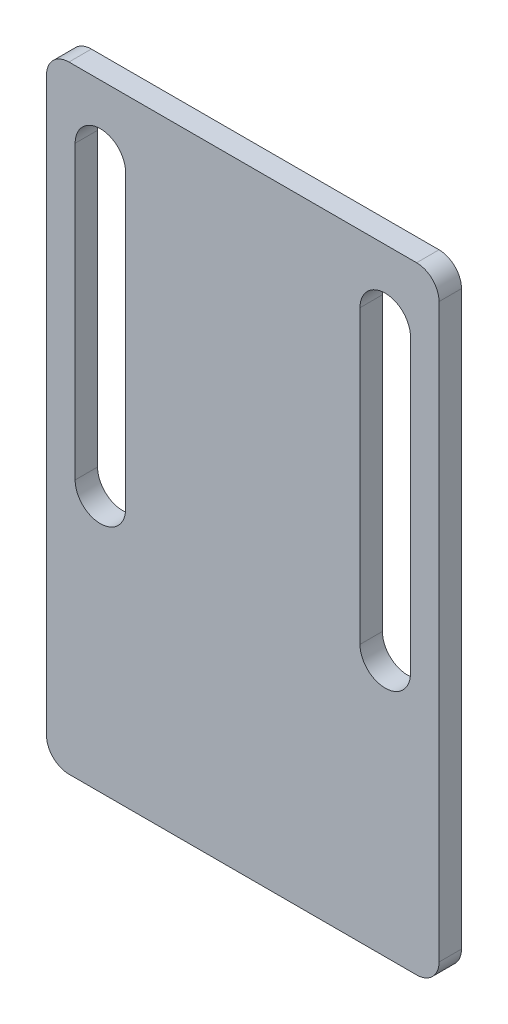
ISO-10303-21;
HEADER;
FILE_DESCRIPTION(('STEP AP214'),'2;1');
FILE_NAME('part.step','',(''),(''),'','','');
FILE_SCHEMA(('AUTOMOTIVE_DESIGN { 1 0 10303 214 1 1 1 1 }'));
ENDSEC;
DATA;
#1=APPLICATION_CONTEXT('core data for automotive mechanical design processes');
#2=APPLICATION_PROTOCOL_DEFINITION('international standard','automotive_design',2000,#1);
#3=PRODUCT_CONTEXT('',#1,'mechanical');
#4=PRODUCT('Part','Part','',(#3));
#5=PRODUCT_RELATED_PRODUCT_CATEGORY('part','',(#4));
#6=PRODUCT_DEFINITION_FORMATION('','',#4);
#7=PRODUCT_DEFINITION_CONTEXT('part definition',#1,'design');
#8=PRODUCT_DEFINITION('design','',#6,#7);
#9=PRODUCT_DEFINITION_SHAPE('','',#8);
#10=(LENGTH_UNIT() NAMED_UNIT(*) SI_UNIT(.MILLI.,.METRE.));
#11=(NAMED_UNIT(*) PLANE_ANGLE_UNIT() SI_UNIT($,.RADIAN.));
#12=(NAMED_UNIT(*) SI_UNIT($,.STERADIAN.) SOLID_ANGLE_UNIT());
#13=UNCERTAINTY_MEASURE_WITH_UNIT(LENGTH_MEASURE(1.E-05),#10,'distance_accuracy_value','');
#14=(GEOMETRIC_REPRESENTATION_CONTEXT(3) GLOBAL_UNCERTAINTY_ASSIGNED_CONTEXT((#13)) GLOBAL_UNIT_ASSIGNED_CONTEXT((#10,
#11,#12)) REPRESENTATION_CONTEXT('',''));
#15=CARTESIAN_POINT('',(0.,0.,0.));
#16=DIRECTION('',(0.,0.,1.));
#17=DIRECTION('',(1.,0.,0.));
#18=AXIS2_PLACEMENT_3D('',#15,#16,#17);
#19=CARTESIAN_POINT('',(-17.5,-27.5,2.));
#20=DIRECTION('',(1.,0.,0.));
#21=DIRECTION('',(0.,-1.,0.));
#22=AXIS2_PLACEMENT_3D('',#19,#20,#21);
#23=PLANE('',#22);
#24=DIRECTION('',(0.,-1.,0.));
#25=VECTOR('',#24,1.);
#26=CARTESIAN_POINT('',(-17.5,-27.5,2.));
#27=LINE('',#26,#25);
#28=CARTESIAN_POINT('',(-17.5,25.5,2.));
#29=VERTEX_POINT('',#28);
#30=CARTESIAN_POINT('',(-17.5,-25.5,2.));
#31=VERTEX_POINT('',#30);
#32=EDGE_CURVE('E215',#29,#31,#27,.T.);
#33=ORIENTED_EDGE('',*,*,#32,.F.);
#34=DIRECTION('',(0.,0.,-1.));
#35=VECTOR('',#34,1.);
#36=CARTESIAN_POINT('',(-17.5,25.5,2.));
#37=LINE('',#36,#35);
#38=CARTESIAN_POINT('',(-17.5,25.5,0.));
#39=VERTEX_POINT('',#38);
#40=EDGE_CURVE('E262',#29,#39,#37,.T.);
#41=ORIENTED_EDGE('',*,*,#40,.T.);
#42=DIRECTION('',(0.,1.,0.));
#43=VECTOR('',#42,1.);
#44=CARTESIAN_POINT('',(-17.5,0.,0.));
#45=LINE('',#44,#43);
#46=CARTESIAN_POINT('',(-17.5,-25.5,0.));
#47=VERTEX_POINT('',#46);
#48=EDGE_CURVE('E226',#39,#47,#45,.F.);
#49=ORIENTED_EDGE('',*,*,#48,.T.);
#50=DIRECTION('',(0.,0.,-1.));
#51=VECTOR('',#50,1.);
#52=CARTESIAN_POINT('',(-17.5,-25.5,2.));
#53=LINE('',#52,#51);
#54=EDGE_CURVE('E259',#47,#31,#53,.F.);
#55=ORIENTED_EDGE('',*,*,#54,.T.);
#56=EDGE_LOOP('',(#33,#41,#49,#55));
#57=FACE_BOUND('',#56,.T.);
#58=ADVANCED_FACE('F38',(#57),#23,.F.);
#59=CARTESIAN_POINT('',(-17.5,-27.5,2.));
#60=DIRECTION('',(0.,1.,0.));
#61=DIRECTION('',(1.,0.,0.));
#62=AXIS2_PLACEMENT_3D('',#59,#60,#61);
#63=PLANE('',#62);
#64=DIRECTION('',(-1.,0.,0.));
#65=VECTOR('',#64,1.);
#66=CARTESIAN_POINT('',(0.,-27.5,0.));
#67=LINE('',#66,#65);
#68=CARTESIAN_POINT('',(-15.5,-27.5,0.));
#69=VERTEX_POINT('',#68);
#70=CARTESIAN_POINT('',(15.5,-27.5,0.));
#71=VERTEX_POINT('',#70);
#72=EDGE_CURVE('E212',#69,#71,#67,.F.);
#73=ORIENTED_EDGE('',*,*,#72,.T.);
#74=DIRECTION('',(0.,0.,-1.));
#75=VECTOR('',#74,1.);
#76=CARTESIAN_POINT('',(15.5,-27.5,2.));
#77=LINE('',#76,#75);
#78=CARTESIAN_POINT('',(15.5,-27.5,2.));
#79=VERTEX_POINT('',#78);
#80=EDGE_CURVE('E11',#71,#79,#77,.F.);
#81=ORIENTED_EDGE('',*,*,#80,.T.);
#82=DIRECTION('',(1.,0.,0.));
#83=VECTOR('',#82,1.);
#84=CARTESIAN_POINT('',(-17.5,-27.5,2.));
#85=LINE('',#84,#83);
#86=CARTESIAN_POINT('',(-15.5,-27.5,2.));
#87=VERTEX_POINT('',#86);
#88=EDGE_CURVE('E218',#87,#79,#85,.T.);
#89=ORIENTED_EDGE('',*,*,#88,.F.);
#90=DIRECTION('',(0.,0.,-1.));
#91=VECTOR('',#90,1.);
#92=CARTESIAN_POINT('',(-15.5,-27.5,2.));
#93=LINE('',#92,#91);
#94=EDGE_CURVE('E46',#87,#69,#93,.T.);
#95=ORIENTED_EDGE('',*,*,#94,.T.);
#96=EDGE_LOOP('',(#73,#81,#89,#95));
#97=FACE_BOUND('',#96,.T.);
#98=ADVANCED_FACE('F287',(#97),#63,.F.);
#99=CARTESIAN_POINT('',(17.5,-27.5,2.));
#100=DIRECTION('',(-1.,0.,0.));
#101=DIRECTION('',(0.,1.,0.));
#102=AXIS2_PLACEMENT_3D('',#99,#100,#101);
#103=PLANE('',#102);
#104=DIRECTION('',(0.,1.,0.));
#105=VECTOR('',#104,1.);
#106=CARTESIAN_POINT('',(17.5,0.,0.));
#107=LINE('',#106,#105);
#108=CARTESIAN_POINT('',(17.5,-25.5,0.));
#109=VERTEX_POINT('',#108);
#110=CARTESIAN_POINT('',(17.5,25.5,0.));
#111=VERTEX_POINT('',#110);
#112=EDGE_CURVE('E201',#109,#111,#107,.T.);
#113=ORIENTED_EDGE('',*,*,#112,.T.);
#114=DIRECTION('',(0.,0.,-1.));
#115=VECTOR('',#114,1.);
#116=CARTESIAN_POINT('',(17.5,25.5,2.));
#117=LINE('',#116,#115);
#118=CARTESIAN_POINT('',(17.5,25.5,2.));
#119=VERTEX_POINT('',#118);
#120=EDGE_CURVE('E273',#111,#119,#117,.F.);
#121=ORIENTED_EDGE('',*,*,#120,.T.);
#122=DIRECTION('',(0.,1.,0.));
#123=VECTOR('',#122,1.);
#124=CARTESIAN_POINT('',(17.5,-27.5,2.));
#125=LINE('',#124,#123);
#126=CARTESIAN_POINT('',(17.5,-25.5,2.));
#127=VERTEX_POINT('',#126);
#128=EDGE_CURVE('E208',#127,#119,#125,.T.);
#129=ORIENTED_EDGE('',*,*,#128,.F.);
#130=DIRECTION('',(0.,0.,-1.));
#131=VECTOR('',#130,1.);
#132=CARTESIAN_POINT('',(17.5,-25.5,2.));
#133=LINE('',#132,#131);
#134=EDGE_CURVE('E271',#127,#109,#133,.T.);
#135=ORIENTED_EDGE('',*,*,#134,.T.);
#136=EDGE_LOOP('',(#113,#121,#129,#135));
#137=FACE_BOUND('',#136,.T.);
#138=ADVANCED_FACE('F278',(#137),#103,.F.);
#139=CARTESIAN_POINT('',(-17.5,27.5,2.));
#140=DIRECTION('',(0.,-1.,0.));
#141=DIRECTION('',(-1.,0.,0.));
#142=AXIS2_PLACEMENT_3D('',#139,#140,#141);
#143=PLANE('',#142);
#144=DIRECTION('',(-1.,0.,0.));
#145=VECTOR('',#144,1.);
#146=CARTESIAN_POINT('',(0.,27.5,0.));
#147=LINE('',#146,#145);
#148=CARTESIAN_POINT('',(15.5,27.5,0.));
#149=VERTEX_POINT('',#148);
#150=CARTESIAN_POINT('',(-15.5,27.5,0.));
#151=VERTEX_POINT('',#150);
#152=EDGE_CURVE('E224',#149,#151,#147,.T.);
#153=ORIENTED_EDGE('',*,*,#152,.T.);
#154=DIRECTION('',(0.,0.,-1.));
#155=VECTOR('',#154,1.);
#156=CARTESIAN_POINT('',(-15.5,27.5,2.));
#157=LINE('',#156,#155);
#158=CARTESIAN_POINT('',(-15.5,27.5,2.));
#159=VERTEX_POINT('',#158);
#160=EDGE_CURVE('E248',#151,#159,#157,.F.);
#161=ORIENTED_EDGE('',*,*,#160,.T.);
#162=DIRECTION('',(-1.,0.,0.));
#163=VECTOR('',#162,1.);
#164=CARTESIAN_POINT('',(-17.5,27.5,2.));
#165=LINE('',#164,#163);
#166=CARTESIAN_POINT('',(15.5,27.5,2.));
#167=VERTEX_POINT('',#166);
#168=EDGE_CURVE('E211',#167,#159,#165,.T.);
#169=ORIENTED_EDGE('',*,*,#168,.F.);
#170=DIRECTION('',(0.,0.,-1.));
#171=VECTOR('',#170,1.);
#172=CARTESIAN_POINT('',(15.5,27.5,2.));
#173=LINE('',#172,#171);
#174=EDGE_CURVE('E246',#167,#149,#173,.T.);
#175=ORIENTED_EDGE('',*,*,#174,.T.);
#176=EDGE_LOOP('',(#153,#161,#169,#175));
#177=FACE_BOUND('',#176,.T.);
#178=ADVANCED_FACE('F301',(#177),#143,.F.);
#179=CARTESIAN_POINT('',(0.,0.,2.));
#180=DIRECTION('',(0.,0.,-1.));
#181=DIRECTION('',(-1.,0.,0.));
#182=AXIS2_PLACEMENT_3D('',#179,#180,#181);
#183=PLANE('',#182);
#184=DIRECTION('',(0.,-1.,0.));
#185=VECTOR('',#184,1.);
#186=CARTESIAN_POINT('',(-14.95,21.5,2.));
#187=LINE('',#186,#185);
#188=CARTESIAN_POINT('',(-14.95,21.5,2.));
#189=VERTEX_POINT('',#188);
#190=CARTESIAN_POINT('',(-14.95,-4.5,2.));
#191=VERTEX_POINT('',#190);
#192=EDGE_CURVE('E168',#189,#191,#187,.T.);
#193=ORIENTED_EDGE('',*,*,#192,.F.);
#194=CARTESIAN_POINT('',(-12.7,21.5,2.));
#195=DIRECTION('',(0.,0.,1.));
#196=DIRECTION('',(-1.,0.,0.));
#197=AXIS2_PLACEMENT_3D('',#194,#195,#196);
#198=CIRCLE('',#197,2.25);
#199=CARTESIAN_POINT('',(-10.45,21.5,2.));
#200=VERTEX_POINT('',#199);
#201=EDGE_CURVE('E173',#200,#189,#198,.T.);
#202=ORIENTED_EDGE('',*,*,#201,.F.);
#203=DIRECTION('',(0.,1.,0.));
#204=VECTOR('',#203,1.);
#205=CARTESIAN_POINT('',(-10.45,21.5,2.));
#206=LINE('',#205,#204);
#207=CARTESIAN_POINT('',(-10.45,-4.5,2.));
#208=VERTEX_POINT('',#207);
#209=EDGE_CURVE('E178',#208,#200,#206,.T.);
#210=ORIENTED_EDGE('',*,*,#209,.F.);
#211=CARTESIAN_POINT('',(-12.7,-4.5,2.));
#212=DIRECTION('',(0.,0.,1.));
#213=DIRECTION('',(-1.,0.,0.));
#214=AXIS2_PLACEMENT_3D('',#211,#212,#213);
#215=CIRCLE('',#214,2.24999999999999);
#216=EDGE_CURVE('E157',#191,#208,#215,.T.);
#217=ORIENTED_EDGE('',*,*,#216,.F.);
#218=EDGE_LOOP('',(#193,#202,#210,#217));
#219=FACE_BOUND('',#218,.T.);
#220=DIRECTION('',(0.,-1.,0.));
#221=VECTOR('',#220,1.);
#222=CARTESIAN_POINT('',(10.45,21.5,2.));
#223=LINE('',#222,#221);
#224=CARTESIAN_POINT('',(10.45,21.5,2.));
#225=VERTEX_POINT('',#224);
#226=CARTESIAN_POINT('',(10.45,-4.49999999999999,2.));
#227=VERTEX_POINT('',#226);
#228=EDGE_CURVE('E189',#225,#227,#223,.T.);
#229=ORIENTED_EDGE('',*,*,#228,.F.);
#230=CARTESIAN_POINT('',(12.7,21.5,2.));
#231=DIRECTION('',(0.,0.,1.));
#232=DIRECTION('',(1.,0.,0.));
#233=AXIS2_PLACEMENT_3D('',#230,#231,#232);
#234=CIRCLE('',#233,2.25);
#235=CARTESIAN_POINT('',(14.95,21.5,2.));
#236=VERTEX_POINT('',#235);
#237=EDGE_CURVE('E185',#236,#225,#234,.T.);
#238=ORIENTED_EDGE('',*,*,#237,.F.);
#239=DIRECTION('',(0.,1.,0.));
#240=VECTOR('',#239,1.);
#241=CARTESIAN_POINT('',(14.95,21.5,2.));
#242=LINE('',#241,#240);
#243=CARTESIAN_POINT('',(14.95,-4.49999999999999,2.));
#244=VERTEX_POINT('',#243);
#245=EDGE_CURVE('E195',#244,#236,#242,.T.);
#246=ORIENTED_EDGE('',*,*,#245,.F.);
#247=CARTESIAN_POINT('',(12.7,-4.49999999999999,2.));
#248=DIRECTION('',(0.,0.,1.));
#249=DIRECTION('',(1.,0.,0.));
#250=AXIS2_PLACEMENT_3D('',#247,#248,#249);
#251=CIRCLE('',#250,2.24999999999999);
#252=EDGE_CURVE('E192',#227,#244,#251,.T.);
#253=ORIENTED_EDGE('',*,*,#252,.F.);
#254=EDGE_LOOP('',(#229,#238,#246,#253));
#255=FACE_BOUND('',#254,.T.);
#256=ORIENTED_EDGE('',*,*,#168,.T.);
#257=CARTESIAN_POINT('',(-15.5,25.5,2.));
#258=DIRECTION('',(0.,0.,-1.));
#259=DIRECTION('',(-1.,0.,0.));
#260=AXIS2_PLACEMENT_3D('',#257,#258,#259);
#261=CIRCLE('',#260,2.);
#262=EDGE_CURVE('E257',#159,#29,#261,.F.);
#263=ORIENTED_EDGE('',*,*,#262,.T.);
#264=ORIENTED_EDGE('',*,*,#32,.T.);
#265=CARTESIAN_POINT('',(-15.5,-25.5,2.));
#266=DIRECTION('',(0.,0.,-1.));
#267=DIRECTION('',(-1.,0.,0.));
#268=AXIS2_PLACEMENT_3D('',#265,#266,#267);
#269=CIRCLE('',#268,2.);
#270=EDGE_CURVE('E251',#31,#87,#269,.F.);
#271=ORIENTED_EDGE('',*,*,#270,.T.);
#272=ORIENTED_EDGE('',*,*,#88,.T.);
#273=CARTESIAN_POINT('',(15.5,-25.5,2.));
#274=DIRECTION('',(0.,0.,-1.));
#275=DIRECTION('',(-1.,0.,0.));
#276=AXIS2_PLACEMENT_3D('',#273,#274,#275);
#277=CIRCLE('',#276,2.);
#278=EDGE_CURVE('E253',#79,#127,#277,.F.);
#279=ORIENTED_EDGE('',*,*,#278,.T.);
#280=ORIENTED_EDGE('',*,*,#128,.T.);
#281=CARTESIAN_POINT('',(15.5,25.5,2.));
#282=DIRECTION('',(0.,0.,-1.));
#283=DIRECTION('',(-1.,0.,0.));
#284=AXIS2_PLACEMENT_3D('',#281,#282,#283);
#285=CIRCLE('',#284,2.);
#286=EDGE_CURVE('E255',#119,#167,#285,.F.);
#287=ORIENTED_EDGE('',*,*,#286,.T.);
#288=EDGE_LOOP('',(#256,#263,#264,#271,#272,#279,#280,#287));
#289=FACE_BOUND('',#288,.T.);
#290=ADVANCED_FACE('F175',(#219,#255,#289),#183,.F.);
#291=CARTESIAN_POINT('',(0.,0.,0.));
#292=DIRECTION('',(0.,0.,-1.));
#293=DIRECTION('',(-1.,0.,0.));
#294=AXIS2_PLACEMENT_3D('',#291,#292,#293);
#295=PLANE('',#294);
#296=CARTESIAN_POINT('',(-12.7,21.5,0.));
#297=DIRECTION('',(0.,0.,-1.));
#298=DIRECTION('',(-1.,0.,0.));
#299=AXIS2_PLACEMENT_3D('',#296,#297,#298);
#300=CIRCLE('',#299,2.25);
#301=CARTESIAN_POINT('',(-14.95,21.5,0.));
#302=VERTEX_POINT('',#301);
#303=CARTESIAN_POINT('',(-10.45,21.5,0.));
#304=VERTEX_POINT('',#303);
#305=EDGE_CURVE('E244',#302,#304,#300,.T.);
#306=ORIENTED_EDGE('',*,*,#305,.F.);
#307=DIRECTION('',(0.,1.,0.));
#308=VECTOR('',#307,1.);
#309=CARTESIAN_POINT('',(-14.95,0.,0.));
#310=LINE('',#309,#308);
#311=CARTESIAN_POINT('',(-14.95,-4.5,0.));
#312=VERTEX_POINT('',#311);
#313=EDGE_CURVE('E239',#312,#302,#310,.T.);
#314=ORIENTED_EDGE('',*,*,#313,.F.);
#315=CARTESIAN_POINT('',(-12.7,-4.5,0.));
#316=DIRECTION('',(0.,0.,-1.));
#317=DIRECTION('',(-1.,0.,0.));
#318=AXIS2_PLACEMENT_3D('',#315,#316,#317);
#319=CIRCLE('',#318,2.24999999999999);
#320=CARTESIAN_POINT('',(-10.45,-4.5,0.));
#321=VERTEX_POINT('',#320);
#322=EDGE_CURVE('E160',#321,#312,#319,.T.);
#323=ORIENTED_EDGE('',*,*,#322,.F.);
#324=DIRECTION('',(0.,-1.,0.));
#325=VECTOR('',#324,1.);
#326=CARTESIAN_POINT('',(-10.45,0.,0.));
#327=LINE('',#326,#325);
#328=EDGE_CURVE('E242',#304,#321,#327,.T.);
#329=ORIENTED_EDGE('',*,*,#328,.F.);
#330=EDGE_LOOP('',(#306,#314,#323,#329));
#331=FACE_BOUND('',#330,.T.);
#332=CARTESIAN_POINT('',(12.7,21.5,0.));
#333=DIRECTION('',(0.,0.,-1.));
#334=DIRECTION('',(-1.,0.,0.));
#335=AXIS2_PLACEMENT_3D('',#332,#333,#334);
#336=CIRCLE('',#335,2.25);
#337=CARTESIAN_POINT('',(10.45,21.5,0.));
#338=VERTEX_POINT('',#337);
#339=CARTESIAN_POINT('',(14.95,21.5,0.));
#340=VERTEX_POINT('',#339);
#341=EDGE_CURVE('E237',#338,#340,#336,.T.);
#342=ORIENTED_EDGE('',*,*,#341,.F.);
#343=DIRECTION('',(0.,1.,0.));
#344=VECTOR('',#343,1.);
#345=CARTESIAN_POINT('',(10.45,0.,0.));
#346=LINE('',#345,#344);
#347=CARTESIAN_POINT('',(10.45,-4.49999999999999,0.));
#348=VERTEX_POINT('',#347);
#349=EDGE_CURVE('E221',#348,#338,#346,.T.);
#350=ORIENTED_EDGE('',*,*,#349,.F.);
#351=CARTESIAN_POINT('',(12.7,-4.49999999999999,0.));
#352=DIRECTION('',(0.,0.,-1.));
#353=DIRECTION('',(-1.,0.,0.));
#354=AXIS2_PLACEMENT_3D('',#351,#352,#353);
#355=CIRCLE('',#354,2.24999999999999);
#356=CARTESIAN_POINT('',(14.95,-4.49999999999999,0.));
#357=VERTEX_POINT('',#356);
#358=EDGE_CURVE('E232',#357,#348,#355,.T.);
#359=ORIENTED_EDGE('',*,*,#358,.F.);
#360=DIRECTION('',(0.,-1.,0.));
#361=VECTOR('',#360,1.);
#362=CARTESIAN_POINT('',(14.95,0.,0.));
#363=LINE('',#362,#361);
#364=EDGE_CURVE('E235',#340,#357,#363,.T.);
#365=ORIENTED_EDGE('',*,*,#364,.F.);
#366=EDGE_LOOP('',(#342,#350,#359,#365));
#367=FACE_BOUND('',#366,.T.);
#368=ORIENTED_EDGE('',*,*,#48,.F.);
#369=CARTESIAN_POINT('',(-15.5,25.5,0.));
#370=DIRECTION('',(0.,0.,-1.));
#371=DIRECTION('',(-1.,0.,0.));
#372=AXIS2_PLACEMENT_3D('',#369,#370,#371);
#373=CIRCLE('',#372,2.);
#374=EDGE_CURVE('E269',#39,#151,#373,.T.);
#375=ORIENTED_EDGE('',*,*,#374,.T.);
#376=ORIENTED_EDGE('',*,*,#152,.F.);
#377=CARTESIAN_POINT('',(15.5,25.5,0.));
#378=DIRECTION('',(0.,0.,-1.));
#379=DIRECTION('',(-1.,0.,0.));
#380=AXIS2_PLACEMENT_3D('',#377,#378,#379);
#381=CIRCLE('',#380,2.);
#382=EDGE_CURVE('E267',#149,#111,#381,.T.);
#383=ORIENTED_EDGE('',*,*,#382,.T.);
#384=ORIENTED_EDGE('',*,*,#112,.F.);
#385=CARTESIAN_POINT('',(15.5,-25.5,0.));
#386=DIRECTION('',(0.,0.,-1.));
#387=DIRECTION('',(-1.,0.,0.));
#388=AXIS2_PLACEMENT_3D('',#385,#386,#387);
#389=CIRCLE('',#388,2.);
#390=EDGE_CURVE('E53',#109,#71,#389,.T.);
#391=ORIENTED_EDGE('',*,*,#390,.T.);
#392=ORIENTED_EDGE('',*,*,#72,.F.);
#393=CARTESIAN_POINT('',(-15.5,-25.5,0.));
#394=DIRECTION('',(0.,0.,-1.));
#395=DIRECTION('',(-1.,0.,0.));
#396=AXIS2_PLACEMENT_3D('',#393,#394,#395);
#397=CIRCLE('',#396,2.);
#398=EDGE_CURVE('E264',#69,#47,#397,.T.);
#399=ORIENTED_EDGE('',*,*,#398,.T.);
#400=EDGE_LOOP('',(#368,#375,#376,#383,#384,#391,#392,#399));
#401=FACE_BOUND('',#400,.T.);
#402=ADVANCED_FACE('F290',(#331,#367,#401),#295,.T.);
#403=CARTESIAN_POINT('',(12.7,21.5,-8.));
#404=DIRECTION('',(0.,0.,1.));
#405=DIRECTION('',(1.,0.,0.));
#406=AXIS2_PLACEMENT_3D('',#403,#404,#405);
#407=CYLINDRICAL_SURFACE('',#406,2.25);
#408=ORIENTED_EDGE('',*,*,#341,.T.);
#409=DIRECTION('',(0.,0.,1.));
#410=VECTOR('',#409,1.);
#411=CARTESIAN_POINT('',(14.95,21.5,-8.));
#412=LINE('',#411,#410);
#413=EDGE_CURVE('E199',#340,#236,#412,.T.);
#414=ORIENTED_EDGE('',*,*,#413,.T.);
#415=ORIENTED_EDGE('',*,*,#237,.T.);
#416=DIRECTION('',(0.,0.,1.));
#417=VECTOR('',#416,1.);
#418=CARTESIAN_POINT('',(10.45,21.5,-8.));
#419=LINE('',#418,#417);
#420=EDGE_CURVE('E198',#338,#225,#419,.T.);
#421=ORIENTED_EDGE('',*,*,#420,.F.);
#422=EDGE_LOOP('',(#408,#414,#415,#421));
#423=FACE_BOUND('',#422,.T.);
#424=ADVANCED_FACE('F330',(#423),#407,.F.);
#425=CARTESIAN_POINT('',(14.95,21.5,-8.));
#426=DIRECTION('',(1.,0.,0.));
#427=DIRECTION('',(0.,1.,0.));
#428=AXIS2_PLACEMENT_3D('',#425,#426,#427);
#429=PLANE('',#428);
#430=ORIENTED_EDGE('',*,*,#364,.T.);
#431=DIRECTION('',(0.,0.,1.));
#432=VECTOR('',#431,1.);
#433=CARTESIAN_POINT('',(14.95,-4.49999999999999,-8.));
#434=LINE('',#433,#432);
#435=EDGE_CURVE('E202',#357,#244,#434,.T.);
#436=ORIENTED_EDGE('',*,*,#435,.T.);
#437=ORIENTED_EDGE('',*,*,#245,.T.);
#438=ORIENTED_EDGE('',*,*,#413,.F.);
#439=EDGE_LOOP('',(#430,#436,#437,#438));
#440=FACE_BOUND('',#439,.T.);
#441=ADVANCED_FACE('F335',(#440),#429,.F.);
#442=CARTESIAN_POINT('',(12.7,-4.49999999999999,-8.));
#443=DIRECTION('',(0.,0.,1.));
#444=DIRECTION('',(1.,0.,0.));
#445=AXIS2_PLACEMENT_3D('',#442,#443,#444);
#446=CYLINDRICAL_SURFACE('',#445,2.24999999999999);
#447=ORIENTED_EDGE('',*,*,#358,.T.);
#448=DIRECTION('',(0.,0.,1.));
#449=VECTOR('',#448,1.);
#450=CARTESIAN_POINT('',(10.45,-4.49999999999999,-8.));
#451=LINE('',#450,#449);
#452=EDGE_CURVE('E204',#348,#227,#451,.T.);
#453=ORIENTED_EDGE('',*,*,#452,.T.);
#454=ORIENTED_EDGE('',*,*,#252,.T.);
#455=ORIENTED_EDGE('',*,*,#435,.F.);
#456=EDGE_LOOP('',(#447,#453,#454,#455));
#457=FACE_BOUND('',#456,.T.);
#458=ADVANCED_FACE('F341',(#457),#446,.F.);
#459=CARTESIAN_POINT('',(10.45,21.5,-8.));
#460=DIRECTION('',(-1.,0.,0.));
#461=DIRECTION('',(0.,-1.,0.));
#462=AXIS2_PLACEMENT_3D('',#459,#460,#461);
#463=PLANE('',#462);
#464=ORIENTED_EDGE('',*,*,#349,.T.);
#465=ORIENTED_EDGE('',*,*,#420,.T.);
#466=ORIENTED_EDGE('',*,*,#228,.T.);
#467=ORIENTED_EDGE('',*,*,#452,.F.);
#468=EDGE_LOOP('',(#464,#465,#466,#467));
#469=FACE_BOUND('',#468,.T.);
#470=ADVANCED_FACE('F337',(#469),#463,.F.);
#471=CARTESIAN_POINT('',(-12.7,21.5,-8.));
#472=DIRECTION('',(0.,0.,1.));
#473=DIRECTION('',(1.,0.,0.));
#474=AXIS2_PLACEMENT_3D('',#471,#472,#473);
#475=CYLINDRICAL_SURFACE('',#474,2.25);
#476=ORIENTED_EDGE('',*,*,#305,.T.);
#477=DIRECTION('',(0.,0.,1.));
#478=VECTOR('',#477,1.);
#479=CARTESIAN_POINT('',(-10.45,21.5,-8.));
#480=LINE('',#479,#478);
#481=EDGE_CURVE('E183',#304,#200,#480,.T.);
#482=ORIENTED_EDGE('',*,*,#481,.T.);
#483=ORIENTED_EDGE('',*,*,#201,.T.);
#484=DIRECTION('',(0.,0.,1.));
#485=VECTOR('',#484,1.);
#486=CARTESIAN_POINT('',(-14.95,21.5,-8.));
#487=LINE('',#486,#485);
#488=EDGE_CURVE('E164',#302,#189,#487,.T.);
#489=ORIENTED_EDGE('',*,*,#488,.F.);
#490=EDGE_LOOP('',(#476,#482,#483,#489));
#491=FACE_BOUND('',#490,.T.);
#492=ADVANCED_FACE('F340',(#491),#475,.F.);
#493=CARTESIAN_POINT('',(-10.45,21.5,-8.));
#494=DIRECTION('',(1.,0.,0.));
#495=DIRECTION('',(0.,1.,0.));
#496=AXIS2_PLACEMENT_3D('',#493,#494,#495);
#497=PLANE('',#496);
#498=ORIENTED_EDGE('',*,*,#328,.T.);
#499=DIRECTION('',(0.,0.,1.));
#500=VECTOR('',#499,1.);
#501=CARTESIAN_POINT('',(-10.45,-4.5,-8.));
#502=LINE('',#501,#500);
#503=EDGE_CURVE('E163',#321,#208,#502,.T.);
#504=ORIENTED_EDGE('',*,*,#503,.T.);
#505=ORIENTED_EDGE('',*,*,#209,.T.);
#506=ORIENTED_EDGE('',*,*,#481,.F.);
#507=EDGE_LOOP('',(#498,#504,#505,#506));
#508=FACE_BOUND('',#507,.T.);
#509=ADVANCED_FACE('F351',(#508),#497,.F.);
#510=CARTESIAN_POINT('',(-12.7,-4.5,-8.));
#511=DIRECTION('',(0.,0.,1.));
#512=DIRECTION('',(1.,0.,0.));
#513=AXIS2_PLACEMENT_3D('',#510,#511,#512);
#514=CYLINDRICAL_SURFACE('',#513,2.24999999999999);
#515=ORIENTED_EDGE('',*,*,#322,.T.);
#516=DIRECTION('',(0.,0.,1.));
#517=VECTOR('',#516,1.);
#518=CARTESIAN_POINT('',(-14.95,-4.5,-8.));
#519=LINE('',#518,#517);
#520=EDGE_CURVE('E152',#312,#191,#519,.T.);
#521=ORIENTED_EDGE('',*,*,#520,.T.);
#522=ORIENTED_EDGE('',*,*,#216,.T.);
#523=ORIENTED_EDGE('',*,*,#503,.F.);
#524=EDGE_LOOP('',(#515,#521,#522,#523));
#525=FACE_BOUND('',#524,.T.);
#526=ADVANCED_FACE('F154',(#525),#514,.F.);
#527=CARTESIAN_POINT('',(-14.95,21.5,-8.));
#528=DIRECTION('',(-1.,0.,0.));
#529=DIRECTION('',(0.,-1.,0.));
#530=AXIS2_PLACEMENT_3D('',#527,#528,#529);
#531=PLANE('',#530);
#532=ORIENTED_EDGE('',*,*,#313,.T.);
#533=ORIENTED_EDGE('',*,*,#488,.T.);
#534=ORIENTED_EDGE('',*,*,#192,.T.);
#535=ORIENTED_EDGE('',*,*,#520,.F.);
#536=EDGE_LOOP('',(#532,#533,#534,#535));
#537=FACE_BOUND('',#536,.T.);
#538=ADVANCED_FACE('F169',(#537),#531,.F.);
#539=CARTESIAN_POINT('',(-15.5,25.5,2.));
#540=DIRECTION('',(0.,0.,1.));
#541=DIRECTION('',(1.,0.,0.));
#542=AXIS2_PLACEMENT_3D('',#539,#540,#541);
#543=CYLINDRICAL_SURFACE('',#542,2.);
#544=ORIENTED_EDGE('',*,*,#374,.F.);
#545=ORIENTED_EDGE('',*,*,#40,.F.);
#546=ORIENTED_EDGE('',*,*,#262,.F.);
#547=ORIENTED_EDGE('',*,*,#160,.F.);
#548=EDGE_LOOP('',(#544,#545,#546,#547));
#549=FACE_BOUND('',#548,.T.);
#550=ADVANCED_FACE('F299',(#549),#543,.T.);
#551=CARTESIAN_POINT('',(15.5,25.5,2.));
#552=DIRECTION('',(0.,0.,1.));
#553=DIRECTION('',(1.,0.,0.));
#554=AXIS2_PLACEMENT_3D('',#551,#552,#553);
#555=CYLINDRICAL_SURFACE('',#554,2.);
#556=ORIENTED_EDGE('',*,*,#382,.F.);
#557=ORIENTED_EDGE('',*,*,#174,.F.);
#558=ORIENTED_EDGE('',*,*,#286,.F.);
#559=ORIENTED_EDGE('',*,*,#120,.F.);
#560=EDGE_LOOP('',(#556,#557,#558,#559));
#561=FACE_BOUND('',#560,.T.);
#562=ADVANCED_FACE('F304',(#561),#555,.T.);
#563=CARTESIAN_POINT('',(15.5,-25.5,2.));
#564=DIRECTION('',(0.,0.,1.));
#565=DIRECTION('',(1.,0.,0.));
#566=AXIS2_PLACEMENT_3D('',#563,#564,#565);
#567=CYLINDRICAL_SURFACE('',#566,2.);
#568=ORIENTED_EDGE('',*,*,#390,.F.);
#569=ORIENTED_EDGE('',*,*,#134,.F.);
#570=ORIENTED_EDGE('',*,*,#278,.F.);
#571=ORIENTED_EDGE('',*,*,#80,.F.);
#572=EDGE_LOOP('',(#568,#569,#570,#571));
#573=FACE_BOUND('',#572,.T.);
#574=ADVANCED_FACE('F286',(#573),#567,.T.);
#575=CARTESIAN_POINT('',(-15.5,-25.5,2.));
#576=DIRECTION('',(0.,0.,1.));
#577=DIRECTION('',(1.,0.,0.));
#578=AXIS2_PLACEMENT_3D('',#575,#576,#577);
#579=CYLINDRICAL_SURFACE('',#578,2.);
#580=ORIENTED_EDGE('',*,*,#398,.F.);
#581=ORIENTED_EDGE('',*,*,#94,.F.);
#582=ORIENTED_EDGE('',*,*,#270,.F.);
#583=ORIENTED_EDGE('',*,*,#54,.F.);
#584=EDGE_LOOP('',(#580,#581,#582,#583));
#585=FACE_BOUND('',#584,.T.);
#586=ADVANCED_FACE('F40',(#585),#579,.T.);
#587=CLOSED_SHELL('',(#58,#98,#138,#178,#290,#402,#424,#441,#458,#470,#492,#509,#526,#538,#550,
#562,#574,#586));
#588=MANIFOLD_SOLID_BREP('B2',#587);
#589=ADVANCED_BREP_SHAPE_REPRESENTATION('',(#18,#588),#14);
#590=SHAPE_DEFINITION_REPRESENTATION(#9,#589);
ENDSEC;
END-ISO-10303-21;
